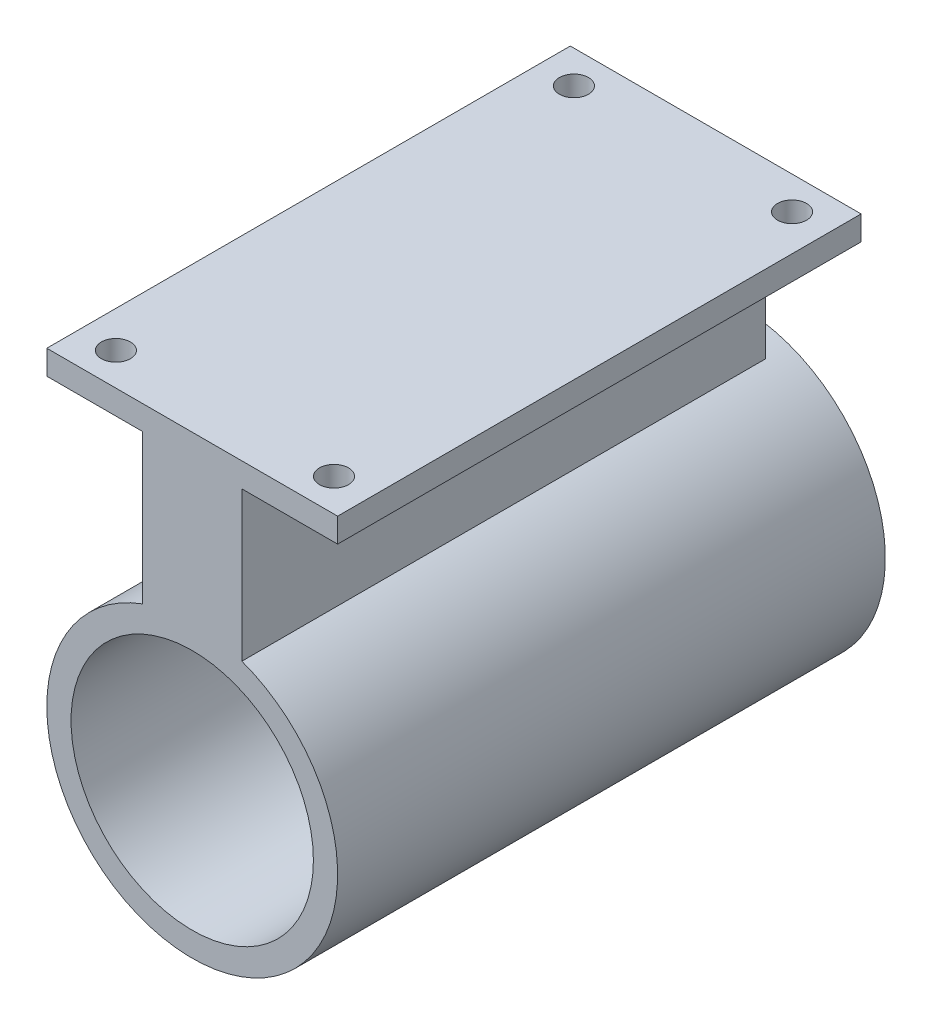
ISO-10303-21;
HEADER;
FILE_DESCRIPTION(('STEP AP214'),'2;1');
FILE_NAME('part.step','',(''),(''),'','','');
FILE_SCHEMA(('AUTOMOTIVE_DESIGN { 1 0 10303 214 1 1 1 1 }'));
ENDSEC;
DATA;
#1=APPLICATION_CONTEXT('core data for automotive mechanical design processes');
#2=APPLICATION_PROTOCOL_DEFINITION('international standard','automotive_design',2000,#1);
#3=PRODUCT_CONTEXT('',#1,'mechanical');
#4=PRODUCT('Part','Part','',(#3));
#5=PRODUCT_RELATED_PRODUCT_CATEGORY('part','',(#4));
#6=PRODUCT_DEFINITION_FORMATION('','',#4);
#7=PRODUCT_DEFINITION_CONTEXT('part definition',#1,'design');
#8=PRODUCT_DEFINITION('design','',#6,#7);
#9=PRODUCT_DEFINITION_SHAPE('','',#8);
#10=(LENGTH_UNIT() NAMED_UNIT(*) SI_UNIT(.MILLI.,.METRE.));
#11=(NAMED_UNIT(*) PLANE_ANGLE_UNIT() SI_UNIT($,.RADIAN.));
#12=(NAMED_UNIT(*) SI_UNIT($,.STERADIAN.) SOLID_ANGLE_UNIT());
#13=UNCERTAINTY_MEASURE_WITH_UNIT(LENGTH_MEASURE(1.E-05),#10,'distance_accuracy_value','');
#14=(GEOMETRIC_REPRESENTATION_CONTEXT(3) GLOBAL_UNCERTAINTY_ASSIGNED_CONTEXT((#13)) GLOBAL_UNIT_ASSIGNED_CONTEXT((#10,
#11,#12)) REPRESENTATION_CONTEXT('',''));
#15=CARTESIAN_POINT('',(0.,0.,0.));
#16=DIRECTION('',(0.,0.,1.));
#17=DIRECTION('',(1.,0.,0.));
#18=AXIS2_PLACEMENT_3D('',#15,#16,#17);
#19=CARTESIAN_POINT('',(0.,-30.75,0.));
#20=DIRECTION('',(0.,0.,1.));
#21=DIRECTION('',(1.,0.,0.));
#22=AXIS2_PLACEMENT_3D('',#19,#20,#21);
#23=PLANE('',#22);
#24=CARTESIAN_POINT('',(0.,-30.75,0.));
#25=DIRECTION('',(0.,0.,-1.));
#26=DIRECTION('',(-1.,0.,0.));
#27=AXIS2_PLACEMENT_3D('',#24,#25,#26);
#28=CIRCLE('',#27,15.);
#29=CARTESIAN_POINT('',(-5.11989742878925,-16.6508280271969,0.));
#30=VERTEX_POINT('',#29);
#31=CARTESIAN_POINT('',(5.11989742878925,-16.6508280271969,0.));
#32=VERTEX_POINT('',#31);
#33=EDGE_CURVE('E156',#30,#32,#28,.T.);
#34=ORIENTED_EDGE('',*,*,#33,.F.);
#35=DIRECTION('',(0.,-1.,0.));
#36=VECTOR('',#35,1.);
#37=CARTESIAN_POINT('',(-5.11989742878925,-13.25,0.));
#38=LINE('',#37,#36);
#39=CARTESIAN_POINT('',(-5.11989742878925,-1.25,0.));
#40=VERTEX_POINT('',#39);
#41=EDGE_CURVE('E139',#40,#30,#38,.T.);
#42=ORIENTED_EDGE('',*,*,#41,.F.);
#43=DIRECTION('',(1.,0.,0.));
#44=VECTOR('',#43,1.);
#45=CARTESIAN_POINT('',(-5.11989742878925,-1.25,0.));
#46=LINE('',#45,#44);
#47=CARTESIAN_POINT('',(-15.,-1.25,0.));
#48=VERTEX_POINT('',#47);
#49=EDGE_CURVE('E135',#48,#40,#46,.T.);
#50=ORIENTED_EDGE('',*,*,#49,.F.);
#51=DIRECTION('',(0.,-1.,0.));
#52=VECTOR('',#51,1.);
#53=CARTESIAN_POINT('',(-15.,-1.25,0.));
#54=LINE('',#53,#52);
#55=CARTESIAN_POINT('',(-15.,1.25,0.));
#56=VERTEX_POINT('',#55);
#57=EDGE_CURVE('E132',#56,#48,#54,.T.);
#58=ORIENTED_EDGE('',*,*,#57,.F.);
#59=DIRECTION('',(-1.,0.,0.));
#60=VECTOR('',#59,1.);
#61=CARTESIAN_POINT('',(15.,1.25,0.));
#62=LINE('',#61,#60);
#63=CARTESIAN_POINT('',(15.,1.25,0.));
#64=VERTEX_POINT('',#63);
#65=EDGE_CURVE('E85',#64,#56,#62,.T.);
#66=ORIENTED_EDGE('',*,*,#65,.F.);
#67=DIRECTION('',(0.,1.,0.));
#68=VECTOR('',#67,1.);
#69=CARTESIAN_POINT('',(15.,-1.25,0.));
#70=LINE('',#69,#68);
#71=CARTESIAN_POINT('',(15.,-1.25,0.));
#72=VERTEX_POINT('',#71);
#73=EDGE_CURVE('E79',#72,#64,#70,.T.);
#74=ORIENTED_EDGE('',*,*,#73,.F.);
#75=DIRECTION('',(1.,0.,0.));
#76=VECTOR('',#75,1.);
#77=CARTESIAN_POINT('',(15.,-1.25,0.));
#78=LINE('',#77,#76);
#79=CARTESIAN_POINT('',(5.11989742878925,-1.25,0.));
#80=VERTEX_POINT('',#79);
#81=EDGE_CURVE('E122',#80,#72,#78,.T.);
#82=ORIENTED_EDGE('',*,*,#81,.F.);
#83=DIRECTION('',(0.,1.,0.));
#84=VECTOR('',#83,1.);
#85=CARTESIAN_POINT('',(5.11989742878925,-13.25,0.));
#86=LINE('',#85,#84);
#87=EDGE_CURVE('E141',#32,#80,#86,.T.);
#88=ORIENTED_EDGE('',*,*,#87,.F.);
#89=EDGE_LOOP('',(#34,#42,#50,#58,#66,#74,#82,#88));
#90=FACE_BOUND('',#89,.T.);
#91=ADVANCED_FACE('F33',(#90),#23,.F.);
#92=CARTESIAN_POINT('',(0.,-30.75,54.));
#93=DIRECTION('',(0.,0.,1.));
#94=DIRECTION('',(1.,0.,0.));
#95=AXIS2_PLACEMENT_3D('',#92,#93,#94);
#96=PLANE('',#95);
#97=DIRECTION('',(0.,-1.,0.));
#98=VECTOR('',#97,1.);
#99=CARTESIAN_POINT('',(-15.,-1.25,54.));
#100=LINE('',#99,#98);
#101=CARTESIAN_POINT('',(-15.,1.25,54.));
#102=VERTEX_POINT('',#101);
#103=CARTESIAN_POINT('',(-15.,-1.25,54.));
#104=VERTEX_POINT('',#103);
#105=EDGE_CURVE('E144',#102,#104,#100,.T.);
#106=ORIENTED_EDGE('',*,*,#105,.T.);
#107=DIRECTION('',(1.,0.,0.));
#108=VECTOR('',#107,1.);
#109=CARTESIAN_POINT('',(-5.11989742878925,-1.25,54.));
#110=LINE('',#109,#108);
#111=CARTESIAN_POINT('',(-5.11989742878925,-1.25,54.));
#112=VERTEX_POINT('',#111);
#113=EDGE_CURVE('E93',#104,#112,#110,.T.);
#114=ORIENTED_EDGE('',*,*,#113,.T.);
#115=DIRECTION('',(0.,-1.,0.));
#116=VECTOR('',#115,1.);
#117=CARTESIAN_POINT('',(-5.11989742878925,-13.25,54.));
#118=LINE('',#117,#116);
#119=CARTESIAN_POINT('',(-5.11989742878925,-16.6508280271969,54.));
#120=VERTEX_POINT('',#119);
#121=EDGE_CURVE('E169',#112,#120,#118,.T.);
#122=ORIENTED_EDGE('',*,*,#121,.T.);
#123=CARTESIAN_POINT('',(0.,-30.75,54.));
#124=DIRECTION('',(0.,0.,1.));
#125=DIRECTION('',(1.,0.,0.));
#126=AXIS2_PLACEMENT_3D('',#123,#124,#125);
#127=CIRCLE('',#126,15.);
#128=CARTESIAN_POINT('',(5.11989742878925,-16.6508280271969,54.));
#129=VERTEX_POINT('',#128);
#130=EDGE_CURVE('E171',#120,#129,#127,.T.);
#131=ORIENTED_EDGE('',*,*,#130,.T.);
#132=DIRECTION('',(0.,1.,0.));
#133=VECTOR('',#132,1.);
#134=CARTESIAN_POINT('',(5.11989742878925,-13.25,54.));
#135=LINE('',#134,#133);
#136=CARTESIAN_POINT('',(5.11989742878925,-1.25,54.));
#137=VERTEX_POINT('',#136);
#138=EDGE_CURVE('E114',#129,#137,#135,.T.);
#139=ORIENTED_EDGE('',*,*,#138,.T.);
#140=DIRECTION('',(1.,0.,0.));
#141=VECTOR('',#140,1.);
#142=CARTESIAN_POINT('',(15.,-1.25,54.));
#143=LINE('',#142,#141);
#144=CARTESIAN_POINT('',(15.,-1.25,54.));
#145=VERTEX_POINT('',#144);
#146=EDGE_CURVE('E107',#137,#145,#143,.T.);
#147=ORIENTED_EDGE('',*,*,#146,.T.);
#148=DIRECTION('',(0.,1.,0.));
#149=VECTOR('',#148,1.);
#150=CARTESIAN_POINT('',(15.,-1.25,54.));
#151=LINE('',#150,#149);
#152=CARTESIAN_POINT('',(15.,1.25,54.));
#153=VERTEX_POINT('',#152);
#154=EDGE_CURVE('E112',#145,#153,#151,.T.);
#155=ORIENTED_EDGE('',*,*,#154,.T.);
#156=DIRECTION('',(-1.,0.,0.));
#157=VECTOR('',#156,1.);
#158=CARTESIAN_POINT('',(15.,1.25,54.));
#159=LINE('',#158,#157);
#160=EDGE_CURVE('E52',#153,#102,#159,.T.);
#161=ORIENTED_EDGE('',*,*,#160,.T.);
#162=EDGE_LOOP('',(#106,#114,#122,#131,#139,#147,#155,#161));
#163=FACE_BOUND('',#162,.T.);
#164=CARTESIAN_POINT('',(0.,-30.75,54.));
#165=DIRECTION('',(0.,0.,1.));
#166=DIRECTION('',(1.,0.,0.));
#167=AXIS2_PLACEMENT_3D('',#164,#165,#166);
#168=CIRCLE('',#167,12.5);
#169=CARTESIAN_POINT('',(12.5,-30.75,54.));
#170=VERTEX_POINT('',#169);
#171=EDGE_CURVE('E136',#170,#170,#168,.T.);
#172=ORIENTED_EDGE('',*,*,#171,.F.);
#173=EDGE_LOOP('',(#172));
#174=FACE_BOUND('',#173,.T.);
#175=ADVANCED_FACE('F109',(#163,#174),#96,.T.);
#176=CARTESIAN_POINT('',(-15.,-1.25,54.));
#177=DIRECTION('',(1.,0.,0.));
#178=DIRECTION('',(0.,0.,-1.));
#179=AXIS2_PLACEMENT_3D('',#176,#177,#178);
#180=PLANE('',#179);
#181=ORIENTED_EDGE('',*,*,#57,.T.);
#182=DIRECTION('',(0.,0.,-1.));
#183=VECTOR('',#182,1.);
#184=CARTESIAN_POINT('',(-15.,-1.25,54.));
#185=LINE('',#184,#183);
#186=EDGE_CURVE('E11',#104,#48,#185,.T.);
#187=ORIENTED_EDGE('',*,*,#186,.F.);
#188=ORIENTED_EDGE('',*,*,#105,.F.);
#189=DIRECTION('',(0.,0.,-1.));
#190=VECTOR('',#189,1.);
#191=CARTESIAN_POINT('',(-15.,1.25,54.));
#192=LINE('',#191,#190);
#193=EDGE_CURVE('E128',#102,#56,#192,.T.);
#194=ORIENTED_EDGE('',*,*,#193,.T.);
#195=EDGE_LOOP('',(#181,#187,#188,#194));
#196=FACE_BOUND('',#195,.T.);
#197=ADVANCED_FACE('F35',(#196),#180,.F.);
#198=CARTESIAN_POINT('',(-5.11989742878925,-1.25,54.));
#199=DIRECTION('',(0.,1.,0.));
#200=DIRECTION('',(-1.,0.,0.));
#201=AXIS2_PLACEMENT_3D('',#198,#199,#200);
#202=PLANE('',#201);
#203=CARTESIAN_POINT('',(-11.25,-1.25,3.375));
#204=DIRECTION('',(0.,1.,0.));
#205=DIRECTION('',(1.,0.,0.));
#206=AXIS2_PLACEMENT_3D('',#203,#204,#205);
#207=CIRCLE('',#206,1.5);
#208=CARTESIAN_POINT('',(-9.75,-1.25,3.375));
#209=VERTEX_POINT('',#208);
#210=EDGE_CURVE('E265',#209,#209,#207,.T.);
#211=ORIENTED_EDGE('',*,*,#210,.T.);
#212=EDGE_LOOP('',(#211));
#213=FACE_BOUND('',#212,.T.);
#214=CARTESIAN_POINT('',(-11.25,-1.25,50.625));
#215=DIRECTION('',(0.,1.,0.));
#216=DIRECTION('',(-1.,0.,0.));
#217=AXIS2_PLACEMENT_3D('',#214,#215,#216);
#218=CIRCLE('',#217,1.5);
#219=CARTESIAN_POINT('',(-12.75,-1.25,50.625));
#220=VERTEX_POINT('',#219);
#221=EDGE_CURVE('E271',#220,#220,#218,.T.);
#222=ORIENTED_EDGE('',*,*,#221,.T.);
#223=EDGE_LOOP('',(#222));
#224=FACE_BOUND('',#223,.T.);
#225=ORIENTED_EDGE('',*,*,#49,.T.);
#226=DIRECTION('',(0.,0.,-1.));
#227=VECTOR('',#226,1.);
#228=CARTESIAN_POINT('',(-5.11989742878925,-1.25,54.));
#229=LINE('',#228,#227);
#230=EDGE_CURVE('E43',#112,#40,#229,.T.);
#231=ORIENTED_EDGE('',*,*,#230,.F.);
#232=ORIENTED_EDGE('',*,*,#113,.F.);
#233=ORIENTED_EDGE('',*,*,#186,.T.);
#234=EDGE_LOOP('',(#225,#231,#232,#233));
#235=FACE_BOUND('',#234,.T.);
#236=ADVANCED_FACE('F305',(#213,#224,#235),#202,.F.);
#237=CARTESIAN_POINT('',(-5.11989742878925,-13.25,54.));
#238=DIRECTION('',(1.,0.,0.));
#239=DIRECTION('',(0.,0.,-1.));
#240=AXIS2_PLACEMENT_3D('',#237,#238,#239);
#241=PLANE('',#240);
#242=ORIENTED_EDGE('',*,*,#41,.T.);
#243=DIRECTION('',(0.,0.,-1.));
#244=VECTOR('',#243,1.);
#245=CARTESIAN_POINT('',(-5.11989742878925,-16.6508280271969,54.));
#246=LINE('',#245,#244);
#247=EDGE_CURVE('E150',#120,#30,#246,.T.);
#248=ORIENTED_EDGE('',*,*,#247,.F.);
#249=ORIENTED_EDGE('',*,*,#121,.F.);
#250=ORIENTED_EDGE('',*,*,#230,.T.);
#251=EDGE_LOOP('',(#242,#248,#249,#250));
#252=FACE_BOUND('',#251,.T.);
#253=ADVANCED_FACE('F298',(#252),#241,.F.);
#254=CARTESIAN_POINT('',(0.,-30.75,54.));
#255=DIRECTION('',(0.,0.,-1.));
#256=DIRECTION('',(-1.,0.,0.));
#257=AXIS2_PLACEMENT_3D('',#254,#255,#256);
#258=CYLINDRICAL_SURFACE('',#257,15.);
#259=ORIENTED_EDGE('',*,*,#247,.T.);
#260=ORIENTED_EDGE('',*,*,#33,.T.);
#261=DIRECTION('',(0.,0.,-1.));
#262=VECTOR('',#261,1.);
#263=CARTESIAN_POINT('',(5.11989742878925,-16.6508280271969,54.));
#264=LINE('',#263,#262);
#265=EDGE_CURVE('E148',#129,#32,#264,.T.);
#266=ORIENTED_EDGE('',*,*,#265,.F.);
#267=ORIENTED_EDGE('',*,*,#130,.F.);
#268=EDGE_LOOP('',(#259,#260,#266,#267));
#269=FACE_BOUND('',#268,.T.);
#270=CARTESIAN_POINT('',(0.,-30.75,-2.5));
#271=DIRECTION('',(0.,0.,-1.));
#272=DIRECTION('',(-1.,0.,0.));
#273=AXIS2_PLACEMENT_3D('',#270,#271,#272);
#274=CIRCLE('',#273,15.);
#275=CARTESIAN_POINT('',(-15.,-30.75,-2.5));
#276=VERTEX_POINT('',#275);
#277=EDGE_CURVE('E159',#276,#276,#274,.T.);
#278=ORIENTED_EDGE('',*,*,#277,.F.);
#279=EDGE_LOOP('',(#278));
#280=FACE_BOUND('',#279,.T.);
#281=ADVANCED_FACE('F179',(#269,#280),#258,.T.);
#282=CARTESIAN_POINT('',(5.11989742878925,-13.25,54.));
#283=DIRECTION('',(-1.,0.,0.));
#284=DIRECTION('',(0.,0.,1.));
#285=AXIS2_PLACEMENT_3D('',#282,#283,#284);
#286=PLANE('',#285);
#287=ORIENTED_EDGE('',*,*,#87,.T.);
#288=DIRECTION('',(0.,0.,-1.));
#289=VECTOR('',#288,1.);
#290=CARTESIAN_POINT('',(5.11989742878925,-1.25,54.));
#291=LINE('',#290,#289);
#292=EDGE_CURVE('E123',#137,#80,#291,.T.);
#293=ORIENTED_EDGE('',*,*,#292,.F.);
#294=ORIENTED_EDGE('',*,*,#138,.F.);
#295=ORIENTED_EDGE('',*,*,#265,.T.);
#296=EDGE_LOOP('',(#287,#293,#294,#295));
#297=FACE_BOUND('',#296,.T.);
#298=ADVANCED_FACE('F185',(#297),#286,.F.);
#299=CARTESIAN_POINT('',(15.,-1.25,54.));
#300=DIRECTION('',(0.,1.,0.));
#301=DIRECTION('',(-1.,0.,0.));
#302=AXIS2_PLACEMENT_3D('',#299,#300,#301);
#303=PLANE('',#302);
#304=CARTESIAN_POINT('',(11.25,-1.25,3.375));
#305=DIRECTION('',(0.,1.,0.));
#306=DIRECTION('',(-1.,0.,0.));
#307=AXIS2_PLACEMENT_3D('',#304,#305,#306);
#308=CIRCLE('',#307,1.5);
#309=CARTESIAN_POINT('',(9.75,-1.25,3.375));
#310=VERTEX_POINT('',#309);
#311=EDGE_CURVE('E252',#310,#310,#308,.T.);
#312=ORIENTED_EDGE('',*,*,#311,.T.);
#313=EDGE_LOOP('',(#312));
#314=FACE_BOUND('',#313,.T.);
#315=CARTESIAN_POINT('',(11.25,-1.25,50.625));
#316=DIRECTION('',(0.,1.,0.));
#317=DIRECTION('',(1.,0.,0.));
#318=AXIS2_PLACEMENT_3D('',#315,#316,#317);
#319=CIRCLE('',#318,1.5);
#320=CARTESIAN_POINT('',(12.75,-1.25,50.625));
#321=VERTEX_POINT('',#320);
#322=EDGE_CURVE('E259',#321,#321,#319,.T.);
#323=ORIENTED_EDGE('',*,*,#322,.T.);
#324=EDGE_LOOP('',(#323));
#325=FACE_BOUND('',#324,.T.);
#326=ORIENTED_EDGE('',*,*,#81,.T.);
#327=DIRECTION('',(0.,0.,-1.));
#328=VECTOR('',#327,1.);
#329=CARTESIAN_POINT('',(15.,-1.25,54.));
#330=LINE('',#329,#328);
#331=EDGE_CURVE('E119',#145,#72,#330,.T.);
#332=ORIENTED_EDGE('',*,*,#331,.F.);
#333=ORIENTED_EDGE('',*,*,#146,.F.);
#334=ORIENTED_EDGE('',*,*,#292,.T.);
#335=EDGE_LOOP('',(#326,#332,#333,#334));
#336=FACE_BOUND('',#335,.T.);
#337=ADVANCED_FACE('F120',(#314,#325,#336),#303,.F.);
#338=CARTESIAN_POINT('',(15.,-1.25,54.));
#339=DIRECTION('',(-1.,0.,0.));
#340=DIRECTION('',(0.,0.,1.));
#341=AXIS2_PLACEMENT_3D('',#338,#339,#340);
#342=PLANE('',#341);
#343=ORIENTED_EDGE('',*,*,#73,.T.);
#344=DIRECTION('',(0.,0.,-1.));
#345=VECTOR('',#344,1.);
#346=CARTESIAN_POINT('',(15.,1.25,54.));
#347=LINE('',#346,#345);
#348=EDGE_CURVE('E124',#153,#64,#347,.T.);
#349=ORIENTED_EDGE('',*,*,#348,.F.);
#350=ORIENTED_EDGE('',*,*,#154,.F.);
#351=ORIENTED_EDGE('',*,*,#331,.T.);
#352=EDGE_LOOP('',(#343,#349,#350,#351));
#353=FACE_BOUND('',#352,.T.);
#354=ADVANCED_FACE('F126',(#353),#342,.F.);
#355=CARTESIAN_POINT('',(15.,1.25,54.));
#356=DIRECTION('',(0.,-1.,0.));
#357=DIRECTION('',(1.,0.,0.));
#358=AXIS2_PLACEMENT_3D('',#355,#356,#357);
#359=PLANE('',#358);
#360=CARTESIAN_POINT('',(11.25,1.25,3.375));
#361=DIRECTION('',(0.,1.,0.));
#362=DIRECTION('',(-1.,0.,0.));
#363=AXIS2_PLACEMENT_3D('',#360,#361,#362);
#364=CIRCLE('',#363,1.5);
#365=CARTESIAN_POINT('',(9.75,1.25,3.375));
#366=VERTEX_POINT('',#365);
#367=EDGE_CURVE('E254',#366,#366,#364,.T.);
#368=ORIENTED_EDGE('',*,*,#367,.F.);
#369=EDGE_LOOP('',(#368));
#370=FACE_BOUND('',#369,.T.);
#371=CARTESIAN_POINT('',(11.25,1.25,50.625));
#372=DIRECTION('',(0.,1.,0.));
#373=DIRECTION('',(1.,0.,0.));
#374=AXIS2_PLACEMENT_3D('',#371,#372,#373);
#375=CIRCLE('',#374,1.5);
#376=CARTESIAN_POINT('',(12.75,1.25,50.625));
#377=VERTEX_POINT('',#376);
#378=EDGE_CURVE('E256',#377,#377,#375,.T.);
#379=ORIENTED_EDGE('',*,*,#378,.F.);
#380=EDGE_LOOP('',(#379));
#381=FACE_BOUND('',#380,.T.);
#382=CARTESIAN_POINT('',(-11.25,1.25,3.375));
#383=DIRECTION('',(0.,1.,0.));
#384=DIRECTION('',(1.,0.,0.));
#385=AXIS2_PLACEMENT_3D('',#382,#383,#384);
#386=CIRCLE('',#385,1.5);
#387=CARTESIAN_POINT('',(-9.75,1.25,3.375));
#388=VERTEX_POINT('',#387);
#389=EDGE_CURVE('E262',#388,#388,#386,.T.);
#390=ORIENTED_EDGE('',*,*,#389,.F.);
#391=EDGE_LOOP('',(#390));
#392=FACE_BOUND('',#391,.T.);
#393=CARTESIAN_POINT('',(-11.25,1.25,50.625));
#394=DIRECTION('',(0.,1.,0.));
#395=DIRECTION('',(-1.,0.,0.));
#396=AXIS2_PLACEMENT_3D('',#393,#394,#395);
#397=CIRCLE('',#396,1.5);
#398=CARTESIAN_POINT('',(-12.75,1.25,50.625));
#399=VERTEX_POINT('',#398);
#400=EDGE_CURVE('E268',#399,#399,#397,.T.);
#401=ORIENTED_EDGE('',*,*,#400,.F.);
#402=EDGE_LOOP('',(#401));
#403=FACE_BOUND('',#402,.T.);
#404=ORIENTED_EDGE('',*,*,#65,.T.);
#405=ORIENTED_EDGE('',*,*,#193,.F.);
#406=ORIENTED_EDGE('',*,*,#160,.F.);
#407=ORIENTED_EDGE('',*,*,#348,.T.);
#408=EDGE_LOOP('',(#404,#405,#406,#407));
#409=FACE_BOUND('',#408,.T.);
#410=ADVANCED_FACE('F191',(#370,#381,#392,#403,#409),#359,.F.);
#411=CARTESIAN_POINT('',(0.,-30.75,54.));
#412=DIRECTION('',(0.,0.,-1.));
#413=DIRECTION('',(-1.,0.,0.));
#414=AXIS2_PLACEMENT_3D('',#411,#412,#413);
#415=CYLINDRICAL_SURFACE('',#414,12.5);
#416=ORIENTED_EDGE('',*,*,#171,.T.);
#417=EDGE_LOOP('',(#416));
#418=FACE_BOUND('',#417,.T.);
#419=CARTESIAN_POINT('',(0.,-30.75,0.));
#420=DIRECTION('',(0.,0.,1.));
#421=DIRECTION('',(1.,0.,0.));
#422=AXIS2_PLACEMENT_3D('',#419,#420,#421);
#423=CIRCLE('',#422,12.5);
#424=CARTESIAN_POINT('',(12.5,-30.75,0.));
#425=VERTEX_POINT('',#424);
#426=EDGE_CURVE('E164',#425,#425,#423,.T.);
#427=ORIENTED_EDGE('',*,*,#426,.F.);
#428=EDGE_LOOP('',(#427));
#429=FACE_BOUND('',#428,.T.);
#430=ADVANCED_FACE('F193',(#418,#429),#415,.F.);
#431=CARTESIAN_POINT('',(0.,-30.75,-2.5));
#432=DIRECTION('',(0.,0.,-1.));
#433=DIRECTION('',(-1.,0.,0.));
#434=AXIS2_PLACEMENT_3D('',#431,#432,#433);
#435=PLANE('',#434);
#436=CARTESIAN_POINT('',(0.,-22.25,-2.5));
#437=DIRECTION('',(0.,0.,-1.));
#438=DIRECTION('',(-1.,0.,0.));
#439=AXIS2_PLACEMENT_3D('',#436,#437,#438);
#440=CIRCLE('',#439,1.5);
#441=CARTESIAN_POINT('',(-1.5,-22.25,-2.5));
#442=VERTEX_POINT('',#441);
#443=EDGE_CURVE('E274',#442,#442,#440,.T.);
#444=ORIENTED_EDGE('',*,*,#443,.F.);
#445=EDGE_LOOP('',(#444));
#446=FACE_BOUND('',#445,.T.);
#447=CARTESIAN_POINT('',(0.,-39.25,-2.5));
#448=DIRECTION('',(0.,0.,-1.));
#449=DIRECTION('',(-1.,0.,0.));
#450=AXIS2_PLACEMENT_3D('',#447,#448,#449);
#451=CIRCLE('',#450,1.5);
#452=CARTESIAN_POINT('',(-1.49999999999999,-39.25,-2.5));
#453=VERTEX_POINT('',#452);
#454=EDGE_CURVE('E280',#453,#453,#451,.T.);
#455=ORIENTED_EDGE('',*,*,#454,.F.);
#456=EDGE_LOOP('',(#455));
#457=FACE_BOUND('',#456,.T.);
#458=CARTESIAN_POINT('',(0.,-30.75,-2.5));
#459=DIRECTION('',(0.,0.,-1.));
#460=DIRECTION('',(-1.,0.,0.));
#461=AXIS2_PLACEMENT_3D('',#458,#459,#460);
#462=CIRCLE('',#461,3.75);
#463=CARTESIAN_POINT('',(-3.74999999999999,-30.75,-2.5));
#464=VERTEX_POINT('',#463);
#465=EDGE_CURVE('E286',#464,#464,#462,.T.);
#466=ORIENTED_EDGE('',*,*,#465,.F.);
#467=EDGE_LOOP('',(#466));
#468=FACE_BOUND('',#467,.T.);
#469=ORIENTED_EDGE('',*,*,#277,.T.);
#470=EDGE_LOOP('',(#469));
#471=FACE_BOUND('',#470,.T.);
#472=ADVANCED_FACE('F200',(#446,#457,#468,#471),#435,.T.);
#473=CARTESIAN_POINT('',(0.,-30.75,0.));
#474=DIRECTION('',(0.,0.,-1.));
#475=DIRECTION('',(-1.,0.,0.));
#476=AXIS2_PLACEMENT_3D('',#473,#474,#475);
#477=PLANE('',#476);
#478=CARTESIAN_POINT('',(0.,-22.25,0.));
#479=DIRECTION('',(0.,0.,-1.));
#480=DIRECTION('',(-1.,0.,0.));
#481=AXIS2_PLACEMENT_3D('',#478,#479,#480);
#482=CIRCLE('',#481,1.5);
#483=CARTESIAN_POINT('',(-1.5,-22.25,0.));
#484=VERTEX_POINT('',#483);
#485=EDGE_CURVE('E277',#484,#484,#482,.T.);
#486=ORIENTED_EDGE('',*,*,#485,.T.);
#487=EDGE_LOOP('',(#486));
#488=FACE_BOUND('',#487,.T.);
#489=CARTESIAN_POINT('',(0.,-39.25,0.));
#490=DIRECTION('',(0.,0.,-1.));
#491=DIRECTION('',(-1.,0.,0.));
#492=AXIS2_PLACEMENT_3D('',#489,#490,#491);
#493=CIRCLE('',#492,1.5);
#494=CARTESIAN_POINT('',(-1.49999999999999,-39.25,0.));
#495=VERTEX_POINT('',#494);
#496=EDGE_CURVE('E283',#495,#495,#493,.T.);
#497=ORIENTED_EDGE('',*,*,#496,.T.);
#498=EDGE_LOOP('',(#497));
#499=FACE_BOUND('',#498,.T.);
#500=CARTESIAN_POINT('',(0.,-30.75,0.));
#501=DIRECTION('',(0.,0.,-1.));
#502=DIRECTION('',(-1.,0.,0.));
#503=AXIS2_PLACEMENT_3D('',#500,#501,#502);
#504=CIRCLE('',#503,3.75);
#505=CARTESIAN_POINT('',(-3.74999999999999,-30.75,0.));
#506=VERTEX_POINT('',#505);
#507=EDGE_CURVE('E160',#506,#506,#504,.T.);
#508=ORIENTED_EDGE('',*,*,#507,.T.);
#509=EDGE_LOOP('',(#508));
#510=FACE_BOUND('',#509,.T.);
#511=ORIENTED_EDGE('',*,*,#426,.T.);
#512=EDGE_LOOP('',(#511));
#513=FACE_BOUND('',#512,.T.);
#514=ADVANCED_FACE('F213',(#488,#499,#510,#513),#477,.F.);
#515=CARTESIAN_POINT('',(0.,-30.75,0.));
#516=DIRECTION('',(0.,0.,-1.));
#517=DIRECTION('',(-1.,0.,0.));
#518=AXIS2_PLACEMENT_3D('',#515,#516,#517);
#519=CYLINDRICAL_SURFACE('',#518,3.75);
#520=ORIENTED_EDGE('',*,*,#507,.F.);
#521=EDGE_LOOP('',(#520));
#522=FACE_BOUND('',#521,.T.);
#523=ORIENTED_EDGE('',*,*,#465,.T.);
#524=EDGE_LOOP('',(#523));
#525=FACE_BOUND('',#524,.T.);
#526=ADVANCED_FACE('F216',(#522,#525),#519,.F.);
#527=CARTESIAN_POINT('',(0.,-39.25,0.));
#528=DIRECTION('',(0.,0.,-1.));
#529=DIRECTION('',(-1.,0.,0.));
#530=AXIS2_PLACEMENT_3D('',#527,#528,#529);
#531=CYLINDRICAL_SURFACE('',#530,1.5);
#532=ORIENTED_EDGE('',*,*,#496,.F.);
#533=EDGE_LOOP('',(#532));
#534=FACE_BOUND('',#533,.T.);
#535=ORIENTED_EDGE('',*,*,#454,.T.);
#536=EDGE_LOOP('',(#535));
#537=FACE_BOUND('',#536,.T.);
#538=ADVANCED_FACE('F223',(#534,#537),#531,.F.);
#539=CARTESIAN_POINT('',(0.,-22.25,0.));
#540=DIRECTION('',(0.,0.,-1.));
#541=DIRECTION('',(-1.,0.,0.));
#542=AXIS2_PLACEMENT_3D('',#539,#540,#541);
#543=CYLINDRICAL_SURFACE('',#542,1.5);
#544=ORIENTED_EDGE('',*,*,#485,.F.);
#545=EDGE_LOOP('',(#544));
#546=FACE_BOUND('',#545,.T.);
#547=ORIENTED_EDGE('',*,*,#443,.T.);
#548=EDGE_LOOP('',(#547));
#549=FACE_BOUND('',#548,.T.);
#550=ADVANCED_FACE('F227',(#546,#549),#543,.F.);
#551=CARTESIAN_POINT('',(-11.25,-1.25,50.625));
#552=DIRECTION('',(0.,1.,0.));
#553=DIRECTION('',(-1.,0.,0.));
#554=AXIS2_PLACEMENT_3D('',#551,#552,#553);
#555=CYLINDRICAL_SURFACE('',#554,1.5);
#556=ORIENTED_EDGE('',*,*,#221,.F.);
#557=EDGE_LOOP('',(#556));
#558=FACE_BOUND('',#557,.T.);
#559=ORIENTED_EDGE('',*,*,#400,.T.);
#560=EDGE_LOOP('',(#559));
#561=FACE_BOUND('',#560,.T.);
#562=ADVANCED_FACE('F231',(#558,#561),#555,.F.);
#563=CARTESIAN_POINT('',(-11.25,-1.25,3.375));
#564=DIRECTION('',(0.,1.,0.));
#565=DIRECTION('',(-1.,0.,0.));
#566=AXIS2_PLACEMENT_3D('',#563,#564,#565);
#567=CYLINDRICAL_SURFACE('',#566,1.5);
#568=ORIENTED_EDGE('',*,*,#210,.F.);
#569=EDGE_LOOP('',(#568));
#570=FACE_BOUND('',#569,.T.);
#571=ORIENTED_EDGE('',*,*,#389,.T.);
#572=EDGE_LOOP('',(#571));
#573=FACE_BOUND('',#572,.T.);
#574=ADVANCED_FACE('F235',(#570,#573),#567,.F.);
#575=CARTESIAN_POINT('',(11.25,-1.25,50.625));
#576=DIRECTION('',(0.,1.,0.));
#577=DIRECTION('',(-1.,0.,0.));
#578=AXIS2_PLACEMENT_3D('',#575,#576,#577);
#579=CYLINDRICAL_SURFACE('',#578,1.5);
#580=ORIENTED_EDGE('',*,*,#322,.F.);
#581=EDGE_LOOP('',(#580));
#582=FACE_BOUND('',#581,.T.);
#583=ORIENTED_EDGE('',*,*,#378,.T.);
#584=EDGE_LOOP('',(#583));
#585=FACE_BOUND('',#584,.T.);
#586=ADVANCED_FACE('F239',(#582,#585),#579,.F.);
#587=CARTESIAN_POINT('',(11.25,-1.25,3.375));
#588=DIRECTION('',(0.,1.,0.));
#589=DIRECTION('',(-1.,0.,0.));
#590=AXIS2_PLACEMENT_3D('',#587,#588,#589);
#591=CYLINDRICAL_SURFACE('',#590,1.5);
#592=ORIENTED_EDGE('',*,*,#311,.F.);
#593=EDGE_LOOP('',(#592));
#594=FACE_BOUND('',#593,.T.);
#595=ORIENTED_EDGE('',*,*,#367,.T.);
#596=EDGE_LOOP('',(#595));
#597=FACE_BOUND('',#596,.T.);
#598=ADVANCED_FACE('F243',(#594,#597),#591,.F.);
#599=CLOSED_SHELL('',(#91,#175,#197,#236,#253,#281,#298,#337,#354,#410,#430,#472,#514,#526,#538,
#550,#562,#574,#586,#598));
#600=MANIFOLD_SOLID_BREP('B2',#599);
#601=ADVANCED_BREP_SHAPE_REPRESENTATION('',(#18,#600),#14);
#602=SHAPE_DEFINITION_REPRESENTATION(#9,#601);
ENDSEC;
END-ISO-10303-21;
